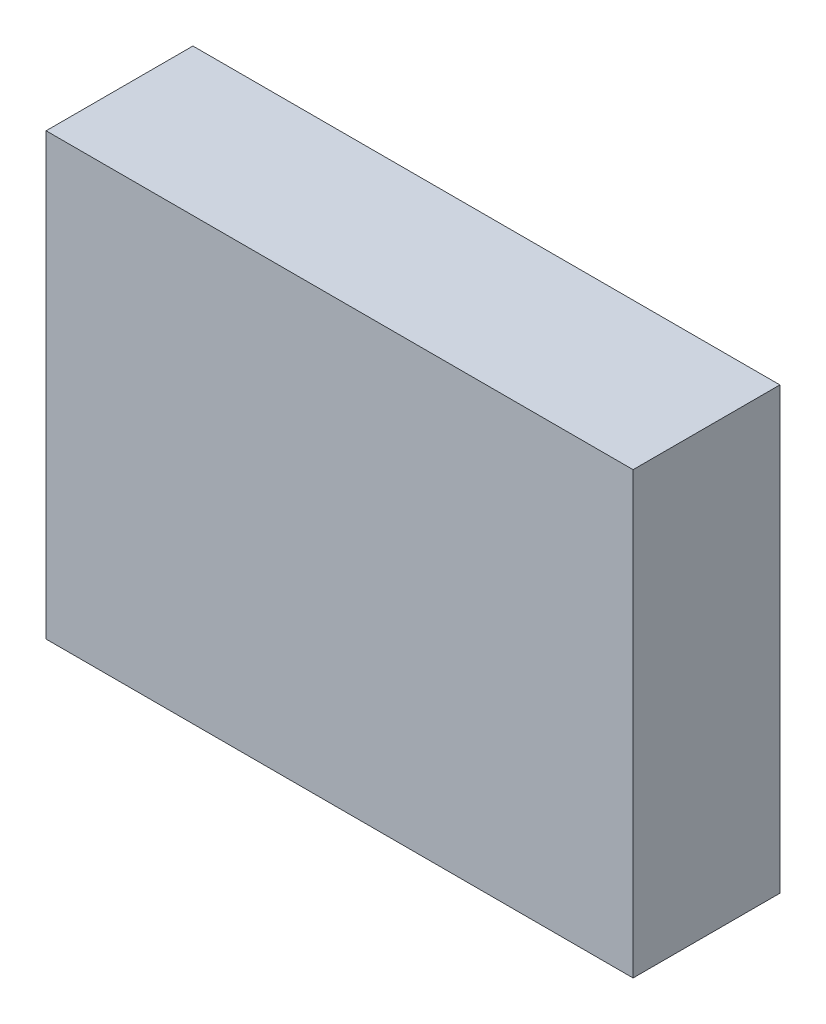
ISO-10303-21;
HEADER;
FILE_DESCRIPTION(('STEP AP214'),'2;1');
FILE_NAME('part.step','',(''),(''),'','','');
FILE_SCHEMA(('AUTOMOTIVE_DESIGN { 1 0 10303 214 1 1 1 1 }'));
ENDSEC;
DATA;
#1=APPLICATION_CONTEXT('core data for automotive mechanical design processes');
#2=APPLICATION_PROTOCOL_DEFINITION('international standard','automotive_design',2000,#1);
#3=PRODUCT_CONTEXT('',#1,'mechanical');
#4=PRODUCT('Part','Part','',(#3));
#5=PRODUCT_RELATED_PRODUCT_CATEGORY('part','',(#4));
#6=PRODUCT_DEFINITION_FORMATION('','',#4);
#7=PRODUCT_DEFINITION_CONTEXT('part definition',#1,'design');
#8=PRODUCT_DEFINITION('design','',#6,#7);
#9=PRODUCT_DEFINITION_SHAPE('','',#8);
#10=(LENGTH_UNIT() NAMED_UNIT(*) SI_UNIT(.MILLI.,.METRE.));
#11=(NAMED_UNIT(*) PLANE_ANGLE_UNIT() SI_UNIT($,.RADIAN.));
#12=(NAMED_UNIT(*) SI_UNIT($,.STERADIAN.) SOLID_ANGLE_UNIT());
#13=UNCERTAINTY_MEASURE_WITH_UNIT(LENGTH_MEASURE(1.E-05),#10,'distance_accuracy_value','');
#14=(GEOMETRIC_REPRESENTATION_CONTEXT(3) GLOBAL_UNCERTAINTY_ASSIGNED_CONTEXT((#13)) GLOBAL_UNIT_ASSIGNED_CONTEXT((#10,
#11,#12)) REPRESENTATION_CONTEXT('',''));
#15=CARTESIAN_POINT('',(0.,0.,0.));
#16=DIRECTION('',(0.,0.,1.));
#17=DIRECTION('',(1.,0.,0.));
#18=AXIS2_PLACEMENT_3D('',#15,#16,#17);
#19=CARTESIAN_POINT('',(58.7800865151283,48.6496566212927,43.6046360424313));
#20=DIRECTION('',(0.,0.,1.));
#21=DIRECTION('',(1.,0.,0.));
#22=AXIS2_PLACEMENT_3D('',#19,#20,#21);
#23=CYLINDRICAL_SURFACE('',#22,10.2);
#24=CARTESIAN_POINT('',(58.7800865151283,48.6496566212927,53.8046360424313));
#25=DIRECTION('',(0.,0.,1.));
#26=DIRECTION('',(1.,0.,0.));
#27=AXIS2_PLACEMENT_3D('',#24,#25,#26);
#28=CIRCLE('',#27,10.2);
#29=CARTESIAN_POINT('',(68.9800865151283,48.6496566212927,53.8046360424313));
#30=VERTEX_POINT('',#29);
#31=EDGE_CURVE('E367',#30,#30,#28,.T.);
#32=ORIENTED_EDGE('',*,*,#31,.F.);
#33=EDGE_LOOP('',(#32));
#34=FACE_BOUND('',#33,.T.);
#35=CARTESIAN_POINT('',(58.7800865151283,48.6496566212927,49.9796360424313));
#36=DIRECTION('',(0.,0.,-1.));
#37=DIRECTION('',(-1.,0.,0.));
#38=AXIS2_PLACEMENT_3D('',#35,#36,#37);
#39=CIRCLE('',#38,10.2);
#40=CARTESIAN_POINT('',(48.5800865151283,48.6496566212927,49.9796360424313));
#41=VERTEX_POINT('',#40);
#42=EDGE_CURVE('E36',#41,#41,#39,.F.);
#43=ORIENTED_EDGE('',*,*,#42,.T.);
#44=EDGE_LOOP('',(#43));
#45=FACE_BOUND('',#44,.T.);
#46=ADVANCED_FACE('F32',(#34,#45),#23,.T.);
#47=CARTESIAN_POINT('',(58.7800865151283,48.6496566212927,53.8046360424313));
#48=DIRECTION('',(0.,0.,1.));
#49=DIRECTION('',(1.,0.,0.));
#50=AXIS2_PLACEMENT_3D('',#47,#48,#49);
#51=PLANE('',#50);
#52=ORIENTED_EDGE('',*,*,#31,.T.);
#53=EDGE_LOOP('',(#52));
#54=FACE_BOUND('',#53,.T.);
#55=CARTESIAN_POINT('',(58.7800865151283,125.149656621293,53.8046360424313));
#56=DIRECTION('',(0.,0.,1.));
#57=DIRECTION('',(1.,0.,0.));
#58=AXIS2_PLACEMENT_3D('',#55,#56,#57);
#59=CIRCLE('',#58,4.08000000000001);
#60=CARTESIAN_POINT('',(62.3134701625688,127.189656621293,53.8046360424313));
#61=VERTEX_POINT('',#60);
#62=CARTESIAN_POINT('',(55.2467028676878,123.109656621293,53.8046360424313));
#63=VERTEX_POINT('',#62);
#64=EDGE_CURVE('E370',#61,#63,#59,.T.);
#65=ORIENTED_EDGE('',*,*,#64,.T.);
#66=DIRECTION('',(0.500000000000004,-0.866025403784436,0.));
#67=VECTOR('',#66,1.);
#68=CARTESIAN_POINT('',(55.2467028676878,123.109656621293,53.8046360424313));
#69=LINE('',#68,#67);
#70=CARTESIAN_POINT('',(75.646702867688,87.7758201468877,53.8046360424313));
#71=VERTEX_POINT('',#70);
#72=EDGE_CURVE('E224',#63,#71,#69,.T.);
#73=ORIENTED_EDGE('',*,*,#72,.T.);
#74=CARTESIAN_POINT('',(79.1800865151285,89.8158201468878,53.8046360424313));
#75=DIRECTION('',(0.,0.,1.));
#76=DIRECTION('',(1.,0.,0.));
#77=AXIS2_PLACEMENT_3D('',#74,#75,#76);
#78=CIRCLE('',#77,4.08000000000001);
#79=CARTESIAN_POINT('',(82.713470162569,91.8558201468878,53.8046360424313));
#80=VERTEX_POINT('',#79);
#81=EDGE_CURVE('E373',#71,#80,#78,.T.);
#82=ORIENTED_EDGE('',*,*,#81,.T.);
#83=DIRECTION('',(0.500000000000004,-0.866025403784436,0.));
#84=VECTOR('',#83,1.);
#85=CARTESIAN_POINT('',(62.3134701625688,127.189656621293,53.8046360424313));
#86=LINE('',#85,#84);
#87=EDGE_CURVE('E228',#61,#80,#86,.T.);
#88=ORIENTED_EDGE('',*,*,#87,.F.);
#89=EDGE_LOOP('',(#65,#73,#82,#88));
#90=FACE_BOUND('',#89,.T.);
#91=DIRECTION('',(-0.46947156278591,0.882947592858916,0.));
#92=VECTOR('',#91,1.);
#93=CARTESIAN_POINT('',(82.1682764227084,64.0581072660459,53.8046360424313));
#94=LINE('',#93,#92);
#95=CARTESIAN_POINT('',(51.6898414890395,121.37970646813,53.8046360424313));
#96=VERTEX_POINT('',#95);
#97=CARTESIAN_POINT('',(82.5737136124385,63.2955908132851,53.8046360424313));
#98=VERTEX_POINT('',#97);
#99=EDGE_CURVE('E277',#96,#98,#94,.F.);
#100=ORIENTED_EDGE('',*,*,#99,.F.);
#101=CARTESIAN_POINT('',(58.7800865151283,125.149656621293,53.8046360424313));
#102=DIRECTION('',(0.,0.,1.));
#103=DIRECTION('',(1.,0.,0.));
#104=AXIS2_PLACEMENT_3D('',#101,#102,#103);
#105=CIRCLE('',#104,8.03019916859524);
#106=CARTESIAN_POINT('',(65.437423340994,129.640087009828,53.8046360424313));
#107=VERTEX_POINT('',#106);
#108=EDGE_CURVE('E275',#107,#96,#105,.T.);
#109=ORIENTED_EDGE('',*,*,#108,.F.);
#110=DIRECTION('',(0.559192903470749,-0.82903757255504,0.));
#111=VECTOR('',#110,1.);
#112=CARTESIAN_POINT('',(65.437423340994,129.640087009828,53.8046360424313));
#113=LINE('',#112,#111);
#114=CARTESIAN_POINT('',(109.068239218926,64.9547423648411,53.8046360424313));
#115=VERTEX_POINT('',#114);
#116=EDGE_CURVE('E260',#115,#107,#113,.F.);
#117=ORIENTED_EDGE('',*,*,#116,.F.);
#118=DIRECTION('',(0.998044963916957,0.0625,0.));
#119=VECTOR('',#118,1.);
#120=CARTESIAN_POINT('',(57.9594490670911,61.7541857767358,53.8046360424313));
#121=LINE('',#120,#119);
#122=CARTESIAN_POINT('',(139.240699067091,66.8442150927123,53.8046360424313));
#123=VERTEX_POINT('',#122);
#124=EDGE_CURVE('E249',#123,#115,#121,.F.);
#125=ORIENTED_EDGE('',*,*,#124,.F.);
#126=CARTESIAN_POINT('',(140.380086515128,48.6496566212927,53.8046360424313));
#127=DIRECTION('',(0.,0.,1.));
#128=DIRECTION('',(1.,0.,0.));
#129=AXIS2_PLACEMENT_3D('',#126,#127,#128);
#130=CIRCLE('',#129,18.2301991685952);
#131=CARTESIAN_POINT('',(139.240699067091,30.4550981498732,53.8046360424313));
#132=VERTEX_POINT('',#131);
#133=EDGE_CURVE('E247',#132,#123,#130,.T.);
#134=ORIENTED_EDGE('',*,*,#133,.F.);
#135=DIRECTION('',(-0.998044963916957,0.0625,0.));
#136=VECTOR('',#135,1.);
#137=CARTESIAN_POINT('',(139.240699067091,30.4550981498732,53.8046360424313));
#138=LINE('',#137,#136);
#139=CARTESIAN_POINT('',(57.9594490670911,35.5451274658496,53.8046360424313));
#140=VERTEX_POINT('',#139);
#141=EDGE_CURVE('E245',#140,#132,#138,.F.);
#142=ORIENTED_EDGE('',*,*,#141,.F.);
#143=CARTESIAN_POINT('',(58.7800865151283,48.6496566212927,53.8046360424313));
#144=DIRECTION('',(0.,0.,1.));
#145=DIRECTION('',(1.,0.,0.));
#146=AXIS2_PLACEMENT_3D('',#143,#144,#145);
#147=CIRCLE('',#146,13.1301991685952);
#148=CARTESIAN_POINT('',(57.9594490670911,61.7541857767358,53.8046360424313));
#149=VERTEX_POINT('',#148);
#150=EDGE_CURVE('E243',#149,#140,#147,.T.);
#151=ORIENTED_EDGE('',*,*,#150,.F.);
#152=DIRECTION('',(0.998044963916957,0.0625,0.));
#153=VECTOR('',#152,1.);
#154=CARTESIAN_POINT('',(57.9594490670911,61.7541857767358,53.8046360424313));
#155=LINE('',#154,#153);
#156=EDGE_CURVE('E237',#98,#149,#155,.F.);
#157=ORIENTED_EDGE('',*,*,#156,.F.);
#158=EDGE_LOOP('',(#100,#109,#117,#125,#134,#142,#151,#157));
#159=FACE_BOUND('',#158,.T.);
#160=DIRECTION('',(-0.866025403784439,-0.5,0.));
#161=VECTOR('',#160,1.);
#162=CARTESIAN_POINT('',(140.380086515128,62.7831912110548,53.8046360424313));
#163=LINE('',#162,#161);
#164=CARTESIAN_POINT('',(140.380086515128,62.7831912110548,53.8046360424313));
#165=VERTEX_POINT('',#164);
#166=CARTESIAN_POINT('',(128.140086515128,55.7164239161738,53.8046360424313));
#167=VERTEX_POINT('',#166);
#168=EDGE_CURVE('E342',#165,#167,#163,.T.);
#169=ORIENTED_EDGE('',*,*,#168,.T.);
#170=DIRECTION('',(0.,-1.,0.));
#171=VECTOR('',#170,1.);
#172=CARTESIAN_POINT('',(128.140086515128,55.7164239161738,53.8046360424313));
#173=LINE('',#172,#171);
#174=CARTESIAN_POINT('',(128.140086515128,41.5828893264117,53.8046360424313));
#175=VERTEX_POINT('',#174);
#176=EDGE_CURVE('E344',#167,#175,#173,.T.);
#177=ORIENTED_EDGE('',*,*,#176,.T.);
#178=DIRECTION('',(0.866025403784438,-0.5,0.));
#179=VECTOR('',#178,1.);
#180=CARTESIAN_POINT('',(128.140086515128,41.5828893264117,53.8046360424313));
#181=LINE('',#180,#179);
#182=CARTESIAN_POINT('',(140.380086515128,34.5161220315307,53.8046360424313));
#183=VERTEX_POINT('',#182);
#184=EDGE_CURVE('E346',#175,#183,#181,.T.);
#185=ORIENTED_EDGE('',*,*,#184,.T.);
#186=DIRECTION('',(0.866025403784439,0.499999999999999,0.));
#187=VECTOR('',#186,1.);
#188=CARTESIAN_POINT('',(140.380086515128,34.5161220315307,53.8046360424313));
#189=LINE('',#188,#187);
#190=CARTESIAN_POINT('',(152.620086515128,41.5828893264117,53.8046360424313));
#191=VERTEX_POINT('',#190);
#192=EDGE_CURVE('E348',#183,#191,#189,.T.);
#193=ORIENTED_EDGE('',*,*,#192,.T.);
#194=DIRECTION('',(0.,1.,0.));
#195=VECTOR('',#194,1.);
#196=CARTESIAN_POINT('',(152.620086515128,41.5828893264117,53.8046360424313));
#197=LINE('',#196,#195);
#198=CARTESIAN_POINT('',(152.620086515128,55.7164239161737,53.8046360424313));
#199=VERTEX_POINT('',#198);
#200=EDGE_CURVE('E329',#191,#199,#197,.T.);
#201=ORIENTED_EDGE('',*,*,#200,.T.);
#202=DIRECTION('',(-0.866025403784439,0.5,0.));
#203=VECTOR('',#202,1.);
#204=CARTESIAN_POINT('',(152.620086515128,55.7164239161737,53.8046360424313));
#205=LINE('',#204,#203);
#206=EDGE_CURVE('E273',#199,#165,#205,.T.);
#207=ORIENTED_EDGE('',*,*,#206,.T.);
#208=EDGE_LOOP('',(#169,#177,#185,#193,#201,#207));
#209=FACE_BOUND('',#208,.T.);
#210=ADVANCED_FACE('F424',(#54,#90,#159,#209),#51,.F.);
#211=CARTESIAN_POINT('',(57.8238365151283,63.9197445692222,49.9796360424313));
#212=DIRECTION('',(-0.062347753141239,0.99561377654642,0.0697564737441255));
#213=DIRECTION('',(0.,-0.0698924504621114,0.997554532528624));
#214=AXIS2_PLACEMENT_3D('',#211,#212,#213);
#215=PLANE('',#214);
#216=DIRECTION('',(-0.00435977960900764,0.0696200973209299,-0.997564050259824));
#217=VECTOR('',#216,1.);
#218=CARTESIAN_POINT('',(57.8238365151283,63.9197445692222,49.9796360424313));
#219=LINE('',#218,#217);
#220=CARTESIAN_POINT('',(57.832259650683,63.7852378808905,51.9069392488693));
#221=VERTEX_POINT('',#220);
#222=CARTESIAN_POINT('',(57.8238365151283,63.9197445692222,49.9796360424313));
#223=VERTEX_POINT('',#222);
#224=EDGE_CURVE('E401',#221,#223,#219,.T.);
#225=ORIENTED_EDGE('',*,*,#224,.T.);
#226=DIRECTION('',(0.998044963916957,0.0625,0.));
#227=VECTOR('',#226,1.);
#228=CARTESIAN_POINT('',(57.8238365151283,63.9197445692222,49.9796360424313));
#229=LINE('',#228,#227);
#230=CARTESIAN_POINT('',(79.0767372561525,65.2506528392273,49.9796360424313));
#231=VERTEX_POINT('',#230);
#232=EDGE_CURVE('E217',#223,#231,#229,.T.);
#233=ORIENTED_EDGE('',*,*,#232,.T.);
#234=DIRECTION('',(0.111770297758268,-0.0624876586261861,0.991767459164922));
#235=VECTOR('',#234,1.);
#236=CARTESIAN_POINT('',(78.8205286948092,65.393891905772,47.7062296098094));
#237=LINE('',#236,#235);
#238=CARTESIAN_POINT('',(79.2939406451762,65.1292204775177,51.9069392488693));
#239=VERTEX_POINT('',#238);
#240=EDGE_CURVE('E398',#239,#231,#237,.F.);
#241=ORIENTED_EDGE('',*,*,#240,.F.);
#242=DIRECTION('',(0.998044963916957,0.0625,0.));
#243=VECTOR('',#242,1.);
#244=CARTESIAN_POINT('',(57.832259650683,63.7852378808905,51.9069392488693));
#245=LINE('',#244,#243);
#246=EDGE_CURVE('E257',#221,#239,#245,.T.);
#247=ORIENTED_EDGE('',*,*,#246,.F.);
#248=EDGE_LOOP('',(#225,#233,#241,#247));
#249=FACE_BOUND('',#248,.T.);
#250=ADVANCED_FACE('F444',(#249),#215,.F.);
#251=DIRECTION('',(0.0354702959443273,0.0720586830829992,-0.996769484032274));
#252=VECTOR('',#251,1.);
#253=CARTESIAN_POINT('',(110.098194501815,67.0471190801594,52.0659172440191));
#254=LINE('',#253,#252);
#255=CARTESIAN_POINT('',(110.172435349703,67.1979409886704,49.9796360424313));
#256=VERTEX_POINT('',#255);
#257=CARTESIAN_POINT('',(110.10385177426,67.0586119530385,51.9069392488693));
#258=VERTEX_POINT('',#257);
#259=EDGE_CURVE('E386',#256,#258,#254,.F.);
#260=ORIENTED_EDGE('',*,*,#259,.F.);
#261=CARTESIAN_POINT('',(139.105086515128,69.0097738851986,49.9796360424313));
#262=VERTEX_POINT('',#261);
#263=EDGE_CURVE('E418',#256,#262,#229,.T.);
#264=ORIENTED_EDGE('',*,*,#263,.T.);
#265=DIRECTION('',(-0.00435977960900784,0.0696200973209298,-0.997564050259824));
#266=VECTOR('',#265,1.);
#267=CARTESIAN_POINT('',(139.105086515128,69.0097738851986,49.9796360424313));
#268=LINE('',#267,#266);
#269=CARTESIAN_POINT('',(139.113509650683,68.875267196867,51.9069392488693));
#270=VERTEX_POINT('',#269);
#271=EDGE_CURVE('E407',#270,#262,#268,.T.);
#272=ORIENTED_EDGE('',*,*,#271,.F.);
#273=DIRECTION('',(0.998044963916957,0.0625,0.));
#274=VECTOR('',#273,1.);
#275=CARTESIAN_POINT('',(57.832259650683,63.7852378808905,51.9069392488693));
#276=LINE('',#275,#274);
#277=EDGE_CURVE('E233',#258,#270,#276,.T.);
#278=ORIENTED_EDGE('',*,*,#277,.F.);
#279=EDGE_LOOP('',(#260,#264,#272,#278));
#280=FACE_BOUND('',#279,.T.);
#281=ADVANCED_FACE('F503',(#280),#215,.F.);
#282=CARTESIAN_POINT('',(58.7800865151283,48.6496566212927,49.9796360424313));
#283=DIRECTION('',(0.,0.,-1.));
#284=DIRECTION('',(1.,0.,0.));
#285=AXIS2_PLACEMENT_3D('',#282,#283,#284);
#286=CONICAL_SURFACE('',#285,15.3,0.0698131700797733);
#287=DIRECTION('',(-0.00435977960900784,-0.0696200973209298,-0.997564050259824));
#288=VECTOR('',#287,1.);
#289=CARTESIAN_POINT('',(57.8238365151283,33.3795686733633,49.9796360424313));
#290=LINE('',#289,#288);
#291=CARTESIAN_POINT('',(57.832259650683,33.5140753616949,51.9069392488693));
#292=VERTEX_POINT('',#291);
#293=CARTESIAN_POINT('',(57.8238365151283,33.3795686733633,49.9796360424313));
#294=VERTEX_POINT('',#293);
#295=EDGE_CURVE('E402',#292,#294,#290,.T.);
#296=ORIENTED_EDGE('',*,*,#295,.T.);
#297=CARTESIAN_POINT('',(58.7800865151283,48.6496566212927,49.9796360424313));
#298=DIRECTION('',(0.,0.,1.));
#299=DIRECTION('',(1.,0.,0.));
#300=AXIS2_PLACEMENT_3D('',#297,#298,#299);
#301=CIRCLE('',#300,15.3);
#302=EDGE_CURVE('E404',#223,#294,#301,.T.);
#303=ORIENTED_EDGE('',*,*,#302,.F.);
#304=ORIENTED_EDGE('',*,*,#224,.F.);
#305=CARTESIAN_POINT('',(58.7800865151283,48.6496566212927,51.9069392488693));
#306=DIRECTION('',(0.,0.,-1.));
#307=DIRECTION('',(-1.,0.,0.));
#308=AXIS2_PLACEMENT_3D('',#305,#306,#307);
#309=CIRCLE('',#308,15.1652298311253);
#310=EDGE_CURVE('E255',#292,#221,#309,.T.);
#311=ORIENTED_EDGE('',*,*,#310,.F.);
#312=EDGE_LOOP('',(#296,#303,#304,#311));
#313=FACE_BOUND('',#312,.T.);
#314=ADVANCED_FACE('F526',(#313),#286,.F.);
#315=CARTESIAN_POINT('',(57.8238365151283,33.3795686733633,49.9796360424313));
#316=DIRECTION('',(-0.062347753141239,-0.99561377654642,0.0697564737441255));
#317=DIRECTION('',(0.,-0.0698924504621114,-0.997554532528624));
#318=AXIS2_PLACEMENT_3D('',#315,#316,#317);
#319=PLANE('',#318);
#320=DIRECTION('',(-0.0043597796090078,-0.0696200973209298,-0.997564050259824));
#321=VECTOR('',#320,1.);
#322=CARTESIAN_POINT('',(139.105086515128,28.2895393573868,49.9796360424313));
#323=LINE('',#322,#321);
#324=CARTESIAN_POINT('',(139.113509650683,28.4240460457185,51.9069392488693));
#325=VERTEX_POINT('',#324);
#326=CARTESIAN_POINT('',(139.105086515128,28.2895393573868,49.9796360424313));
#327=VERTEX_POINT('',#326);
#328=EDGE_CURVE('E405',#325,#327,#323,.T.);
#329=ORIENTED_EDGE('',*,*,#328,.T.);
#330=DIRECTION('',(0.998044963916957,-0.0625,0.));
#331=VECTOR('',#330,1.);
#332=CARTESIAN_POINT('',(57.8238365151283,33.3795686733633,49.9796360424313));
#333=LINE('',#332,#331);
#334=EDGE_CURVE('E412',#294,#327,#333,.T.);
#335=ORIENTED_EDGE('',*,*,#334,.F.);
#336=ORIENTED_EDGE('',*,*,#295,.F.);
#337=DIRECTION('',(0.998044963916957,-0.0625,0.));
#338=VECTOR('',#337,1.);
#339=CARTESIAN_POINT('',(57.832259650683,33.5140753616949,51.9069392488693));
#340=LINE('',#339,#338);
#341=EDGE_CURVE('E253',#325,#292,#340,.F.);
#342=ORIENTED_EDGE('',*,*,#341,.F.);
#343=EDGE_LOOP('',(#329,#335,#336,#342));
#344=FACE_BOUND('',#343,.T.);
#345=ADVANCED_FACE('F530',(#344),#319,.F.);
#346=CARTESIAN_POINT('',(140.380086515128,48.6496566212927,49.9796360424313));
#347=DIRECTION('',(0.,0.,-1.));
#348=DIRECTION('',(-1.,0.,0.));
#349=AXIS2_PLACEMENT_3D('',#346,#347,#348);
#350=CONICAL_SURFACE('',#349,20.4,0.0698131700797733);
#351=ORIENTED_EDGE('',*,*,#271,.T.);
#352=CARTESIAN_POINT('',(140.380086515128,48.6496566212927,49.9796360424313));
#353=DIRECTION('',(0.,0.,-1.));
#354=DIRECTION('',(-1.,0.,0.));
#355=AXIS2_PLACEMENT_3D('',#352,#353,#354);
#356=CIRCLE('',#355,20.4);
#357=EDGE_CURVE('E415',#262,#327,#356,.T.);
#358=ORIENTED_EDGE('',*,*,#357,.T.);
#359=ORIENTED_EDGE('',*,*,#328,.F.);
#360=CARTESIAN_POINT('',(140.380086515128,48.6496566212927,51.9069392488693));
#361=DIRECTION('',(0.,0.,1.));
#362=DIRECTION('',(1.,0.,0.));
#363=AXIS2_PLACEMENT_3D('',#360,#361,#362);
#364=CIRCLE('',#363,20.2652298311253);
#365=EDGE_CURVE('E251',#270,#325,#364,.F.);
#366=ORIENTED_EDGE('',*,*,#365,.F.);
#367=EDGE_LOOP('',(#351,#358,#359,#366));
#368=FACE_BOUND('',#367,.T.);
#369=ADVANCED_FACE('F535',(#368),#350,.F.);
#370=CARTESIAN_POINT('',(58.7800865151283,125.149656621293,49.9796360424313));
#371=DIRECTION('',(0.,0.,-1.));
#372=DIRECTION('',(1.,0.,0.));
#373=AXIS2_PLACEMENT_3D('',#370,#371,#372);
#374=CONICAL_SURFACE('',#373,10.2,0.0698131700797733);
#375=DIRECTION('',(-0.0615913105787018,-0.0327486807430889,-0.997564050259824));
#376=VECTOR('',#375,1.);
#377=CARTESIAN_POINT('',(49.7740210679674,120.361046680876,49.9796360424313));
#378=LINE('',#377,#376);
#379=CARTESIAN_POINT('',(49.8930160641645,120.424317442675,51.9069392488693));
#380=VERTEX_POINT('',#379);
#381=CARTESIAN_POINT('',(49.7740210679674,120.361046680876,49.9796360424313));
#382=VERTEX_POINT('',#381);
#383=EDGE_CURVE('E390',#380,#382,#378,.T.);
#384=ORIENTED_EDGE('',*,*,#383,.T.);
#385=CARTESIAN_POINT('',(58.7800865151283,125.149656621293,49.9796360424313));
#386=DIRECTION('',(0.,0.,1.));
#387=DIRECTION('',(1.,0.,0.));
#388=AXIS2_PLACEMENT_3D('',#385,#386,#387);
#389=CIRCLE('',#388,10.2);
#390=CARTESIAN_POINT('',(67.2362697551897,130.853424236694,49.9796360424313));
#391=VERTEX_POINT('',#390);
#392=EDGE_CURVE('E391',#391,#382,#389,.T.);
#393=ORIENTED_EDGE('',*,*,#392,.F.);
#394=DIRECTION('',(0.0578307376628291,0.0390073250888586,-0.997564050259824));
#395=VECTOR('',#394,1.);
#396=CARTESIAN_POINT('',(67.2362697551897,130.853424236694,49.9796360424313));
#397=LINE('',#396,#395);
#398=CARTESIAN_POINT('',(67.124540221533,130.77806171466,51.9069392488693));
#399=VERTEX_POINT('',#398);
#400=EDGE_CURVE('E379',#399,#391,#397,.T.);
#401=ORIENTED_EDGE('',*,*,#400,.F.);
#402=CARTESIAN_POINT('',(58.7800865151283,125.149656621293,51.9069392488693));
#403=DIRECTION('',(0.,0.,-1.));
#404=DIRECTION('',(-1.,0.,0.));
#405=AXIS2_PLACEMENT_3D('',#402,#403,#404);
#406=CIRCLE('',#405,10.0652298311253);
#407=EDGE_CURVE('E282',#380,#399,#406,.T.);
#408=ORIENTED_EDGE('',*,*,#407,.F.);
#409=EDGE_LOOP('',(#384,#393,#401,#408));
#410=FACE_BOUND('',#409,.T.);
#411=ADVANCED_FACE('F512',(#410),#374,.F.);
#412=CARTESIAN_POINT('',(49.7740210679674,120.361046680876,49.9796360424313));
#413=DIRECTION('',(-0.880796776899503,-0.468327953654522,0.0697564737441255));
#414=DIRECTION('',(0.46947156278591,-0.882947592858916,0.));
#415=AXIS2_PLACEMENT_3D('',#412,#413,#414);
#416=PLANE('',#415);
#417=ORIENTED_EDGE('',*,*,#240,.T.);
#418=DIRECTION('',(0.469471562785911,-0.882947592858917,0.));
#419=VECTOR('',#418,1.);
#420=CARTESIAN_POINT('',(49.7740210679674,120.361046680876,49.9796360424313));
#421=LINE('',#420,#419);
#422=EDGE_CURVE('E387',#382,#231,#421,.T.);
#423=ORIENTED_EDGE('',*,*,#422,.F.);
#424=ORIENTED_EDGE('',*,*,#383,.F.);
#425=DIRECTION('',(0.46947156278591,-0.882947592858916,0.));
#426=VECTOR('',#425,1.);
#427=CARTESIAN_POINT('',(49.8930160641645,120.424317442675,51.9069392488693));
#428=LINE('',#427,#426);
#429=EDGE_CURVE('E280',#239,#380,#428,.F.);
#430=ORIENTED_EDGE('',*,*,#429,.F.);
#431=EDGE_LOOP('',(#417,#423,#424,#430));
#432=FACE_BOUND('',#431,.T.);
#433=ADVANCED_FACE('F517',(#432),#416,.F.);
#434=CARTESIAN_POINT('',(67.2362697551897,130.853424236694,49.9796360424313));
#435=DIRECTION('',(0.827018078695579,0.557830737662832,0.0697564737441255));
#436=DIRECTION('',(-0.559192903470749,0.82903757255504,0.));
#437=AXIS2_PLACEMENT_3D('',#434,#435,#436);
#438=PLANE('',#437);
#439=ORIENTED_EDGE('',*,*,#400,.T.);
#440=DIRECTION('',(-0.559192903470749,0.82903757255504,0.));
#441=VECTOR('',#440,1.);
#442=CARTESIAN_POINT('',(67.2362697551897,130.853424236694,49.9796360424313));
#443=LINE('',#442,#441);
#444=EDGE_CURVE('E383',#256,#391,#443,.T.);
#445=ORIENTED_EDGE('',*,*,#444,.F.);
#446=ORIENTED_EDGE('',*,*,#259,.T.);
#447=DIRECTION('',(-0.559192903470749,0.82903757255504,0.));
#448=VECTOR('',#447,1.);
#449=CARTESIAN_POINT('',(111.379882487331,65.1668186232166,51.9069392488693));
#450=LINE('',#449,#448);
#451=EDGE_CURVE('E284',#399,#258,#450,.F.);
#452=ORIENTED_EDGE('',*,*,#451,.F.);
#453=EDGE_LOOP('',(#439,#445,#446,#452));
#454=FACE_BOUND('',#453,.T.);
#455=ADVANCED_FACE('F436',(#454),#438,.F.);
#456=CARTESIAN_POINT('',(58.7800865151283,125.149656621293,43.6046360424313));
#457=DIRECTION('',(0.,0.,1.));
#458=DIRECTION('',(1.,0.,0.));
#459=AXIS2_PLACEMENT_3D('',#456,#457,#458);
#460=CYLINDRICAL_SURFACE('',#459,4.08000000000001);
#461=DIRECTION('',(0.,0.,1.));
#462=VECTOR('',#461,1.);
#463=CARTESIAN_POINT('',(62.3134701625688,127.189656621293,43.6046360424313));
#464=LINE('',#463,#462);
#465=CARTESIAN_POINT('',(62.3134701625688,127.189656621293,49.9796360424313));
#466=VERTEX_POINT('',#465);
#467=EDGE_CURVE('E231',#466,#61,#464,.T.);
#468=ORIENTED_EDGE('',*,*,#467,.F.);
#469=CARTESIAN_POINT('',(58.7800865151283,125.149656621293,49.9796360424313));
#470=DIRECTION('',(0.,0.,1.));
#471=DIRECTION('',(1.,0.,0.));
#472=AXIS2_PLACEMENT_3D('',#469,#470,#471);
#473=CIRCLE('',#472,4.08000000000001);
#474=CARTESIAN_POINT('',(55.2467028676878,123.109656621293,49.9796360424313));
#475=VERTEX_POINT('',#474);
#476=EDGE_CURVE('E211',#466,#475,#473,.T.);
#477=ORIENTED_EDGE('',*,*,#476,.T.);
#478=DIRECTION('',(0.,0.,1.));
#479=VECTOR('',#478,1.);
#480=CARTESIAN_POINT('',(55.2467028676878,123.109656621293,43.6046360424313));
#481=LINE('',#480,#479);
#482=EDGE_CURVE('E221',#475,#63,#481,.T.);
#483=ORIENTED_EDGE('',*,*,#482,.T.);
#484=ORIENTED_EDGE('',*,*,#64,.F.);
#485=EDGE_LOOP('',(#468,#477,#483,#484));
#486=FACE_BOUND('',#485,.T.);
#487=ADVANCED_FACE('F230',(#486),#460,.T.);
#488=CARTESIAN_POINT('',(62.3134701625688,127.189656621293,43.6046360424313));
#489=DIRECTION('',(-0.866025403784436,-0.500000000000004,0.));
#490=DIRECTION('',(0.500000000000004,-0.866025403784436,0.));
#491=AXIS2_PLACEMENT_3D('',#488,#489,#490);
#492=PLANE('',#491);
#493=DIRECTION('',(0.500000000000004,-0.866025403784436,0.));
#494=VECTOR('',#493,1.);
#495=CARTESIAN_POINT('',(62.3134701625688,127.189656621293,49.9796360424313));
#496=LINE('',#495,#494);
#497=CARTESIAN_POINT('',(82.713470162569,91.8558201468878,49.9796360424313));
#498=VERTEX_POINT('',#497);
#499=EDGE_CURVE('E234',#466,#498,#496,.T.);
#500=ORIENTED_EDGE('',*,*,#499,.F.);
#501=ORIENTED_EDGE('',*,*,#467,.T.);
#502=ORIENTED_EDGE('',*,*,#87,.T.);
#503=DIRECTION('',(0.,0.,1.));
#504=VECTOR('',#503,1.);
#505=CARTESIAN_POINT('',(82.713470162569,91.8558201468878,43.6046360424313));
#506=LINE('',#505,#504);
#507=EDGE_CURVE('E380',#498,#80,#506,.T.);
#508=ORIENTED_EDGE('',*,*,#507,.F.);
#509=EDGE_LOOP('',(#500,#501,#502,#508));
#510=FACE_BOUND('',#509,.T.);
#511=ADVANCED_FACE('F428',(#510),#492,.F.);
#512=CARTESIAN_POINT('',(79.1800865151285,89.8158201468878,43.6046360424313));
#513=DIRECTION('',(0.,0.,1.));
#514=DIRECTION('',(1.,0.,0.));
#515=AXIS2_PLACEMENT_3D('',#512,#513,#514);
#516=CYLINDRICAL_SURFACE('',#515,4.08000000000001);
#517=DIRECTION('',(0.,0.,1.));
#518=VECTOR('',#517,1.);
#519=CARTESIAN_POINT('',(75.646702867688,87.7758201468877,43.6046360424313));
#520=LINE('',#519,#518);
#521=CARTESIAN_POINT('',(75.646702867688,87.7758201468877,49.9796360424313));
#522=VERTEX_POINT('',#521);
#523=EDGE_CURVE('E227',#522,#71,#520,.T.);
#524=ORIENTED_EDGE('',*,*,#523,.F.);
#525=CARTESIAN_POINT('',(79.1800865151285,89.8158201468878,49.9796360424313));
#526=DIRECTION('',(0.,0.,1.));
#527=DIRECTION('',(1.,0.,0.));
#528=AXIS2_PLACEMENT_3D('',#525,#526,#527);
#529=CIRCLE('',#528,4.08000000000001);
#530=EDGE_CURVE('E214',#522,#498,#529,.T.);
#531=ORIENTED_EDGE('',*,*,#530,.T.);
#532=ORIENTED_EDGE('',*,*,#507,.T.);
#533=ORIENTED_EDGE('',*,*,#81,.F.);
#534=EDGE_LOOP('',(#524,#531,#532,#533));
#535=FACE_BOUND('',#534,.T.);
#536=ADVANCED_FACE('F420',(#535),#516,.T.);
#537=CARTESIAN_POINT('',(55.2467028676878,123.109656621293,43.6046360424313));
#538=DIRECTION('',(-0.866025403784436,-0.500000000000004,0.));
#539=DIRECTION('',(0.500000000000004,-0.866025403784436,0.));
#540=AXIS2_PLACEMENT_3D('',#537,#538,#539);
#541=PLANE('',#540);
#542=ORIENTED_EDGE('',*,*,#482,.F.);
#543=DIRECTION('',(0.500000000000004,-0.866025403784436,0.));
#544=VECTOR('',#543,1.);
#545=CARTESIAN_POINT('',(55.2467028676878,123.109656621293,49.9796360424313));
#546=LINE('',#545,#544);
#547=EDGE_CURVE('E207',#475,#522,#546,.T.);
#548=ORIENTED_EDGE('',*,*,#547,.T.);
#549=ORIENTED_EDGE('',*,*,#523,.T.);
#550=ORIENTED_EDGE('',*,*,#72,.F.);
#551=EDGE_LOOP('',(#542,#548,#549,#550));
#552=FACE_BOUND('',#551,.T.);
#553=ADVANCED_FACE('F222',(#552),#541,.T.);
#554=CARTESIAN_POINT('',(152.620086515128,55.7164239161737,60.9446360424313));
#555=DIRECTION('',(-0.5,-0.866025403784439,0.));
#556=DIRECTION('',(0.866025403784439,-0.5,0.));
#557=AXIS2_PLACEMENT_3D('',#554,#555,#556);
#558=PLANE('',#557);
#559=ORIENTED_EDGE('',*,*,#206,.F.);
#560=DIRECTION('',(0.,0.,-1.));
#561=VECTOR('',#560,1.);
#562=CARTESIAN_POINT('',(152.620086515128,55.7164239161737,60.9446360424313));
#563=LINE('',#562,#561);
#564=CARTESIAN_POINT('',(152.620086515128,55.7164239161737,60.9446360424313));
#565=VERTEX_POINT('',#564);
#566=EDGE_CURVE('E339',#565,#199,#563,.T.);
#567=ORIENTED_EDGE('',*,*,#566,.F.);
#568=DIRECTION('',(-0.866025403784439,0.5,0.));
#569=VECTOR('',#568,1.);
#570=CARTESIAN_POINT('',(152.620086515128,55.7164239161737,60.9446360424313));
#571=LINE('',#570,#569);
#572=CARTESIAN_POINT('',(140.380086515128,62.7831912110548,60.9446360424313));
#573=VERTEX_POINT('',#572);
#574=EDGE_CURVE('E325',#565,#573,#571,.T.);
#575=ORIENTED_EDGE('',*,*,#574,.T.);
#576=DIRECTION('',(0.,0.,-1.));
#577=VECTOR('',#576,1.);
#578=CARTESIAN_POINT('',(140.380086515128,62.7831912110548,60.9446360424313));
#579=LINE('',#578,#577);
#580=EDGE_CURVE('E365',#573,#165,#579,.T.);
#581=ORIENTED_EDGE('',*,*,#580,.T.);
#582=EDGE_LOOP('',(#559,#567,#575,#581));
#583=FACE_BOUND('',#582,.T.);
#584=ADVANCED_FACE('F450',(#583),#558,.T.);
#585=CARTESIAN_POINT('',(140.380086515128,62.7831912110548,60.9446360424313));
#586=DIRECTION('',(0.5,-0.866025403784439,0.));
#587=DIRECTION('',(0.866025403784439,0.5,0.));
#588=AXIS2_PLACEMENT_3D('',#585,#586,#587);
#589=PLANE('',#588);
#590=ORIENTED_EDGE('',*,*,#168,.F.);
#591=ORIENTED_EDGE('',*,*,#580,.F.);
#592=DIRECTION('',(-0.866025403784439,-0.5,0.));
#593=VECTOR('',#592,1.);
#594=CARTESIAN_POINT('',(140.380086515128,62.7831912110548,60.9446360424313));
#595=LINE('',#594,#593);
#596=CARTESIAN_POINT('',(128.140086515128,55.7164239161738,60.9446360424313));
#597=VERTEX_POINT('',#596);
#598=EDGE_CURVE('E328',#573,#597,#595,.T.);
#599=ORIENTED_EDGE('',*,*,#598,.T.);
#600=DIRECTION('',(0.,0.,-1.));
#601=VECTOR('',#600,1.);
#602=CARTESIAN_POINT('',(128.140086515128,55.7164239161738,60.9446360424313));
#603=LINE('',#602,#601);
#604=EDGE_CURVE('E362',#597,#167,#603,.T.);
#605=ORIENTED_EDGE('',*,*,#604,.T.);
#606=EDGE_LOOP('',(#590,#591,#599,#605));
#607=FACE_BOUND('',#606,.T.);
#608=ADVANCED_FACE('F453',(#607),#589,.T.);
#609=CARTESIAN_POINT('',(128.140086515128,55.7164239161738,60.9446360424313));
#610=DIRECTION('',(1.,0.,0.));
#611=DIRECTION('',(0.,0.,-1.));
#612=AXIS2_PLACEMENT_3D('',#609,#610,#611);
#613=PLANE('',#612);
#614=ORIENTED_EDGE('',*,*,#176,.F.);
#615=ORIENTED_EDGE('',*,*,#604,.F.);
#616=DIRECTION('',(0.,-1.,0.));
#617=VECTOR('',#616,1.);
#618=CARTESIAN_POINT('',(128.140086515128,55.7164239161738,60.9446360424313));
#619=LINE('',#618,#617);
#620=CARTESIAN_POINT('',(128.140086515128,41.5828893264117,60.9446360424313));
#621=VERTEX_POINT('',#620);
#622=EDGE_CURVE('E331',#597,#621,#619,.T.);
#623=ORIENTED_EDGE('',*,*,#622,.T.);
#624=DIRECTION('',(0.,0.,-1.));
#625=VECTOR('',#624,1.);
#626=CARTESIAN_POINT('',(128.140086515128,41.5828893264117,60.9446360424313));
#627=LINE('',#626,#625);
#628=EDGE_CURVE('E359',#621,#175,#627,.T.);
#629=ORIENTED_EDGE('',*,*,#628,.T.);
#630=EDGE_LOOP('',(#614,#615,#623,#629));
#631=FACE_BOUND('',#630,.T.);
#632=ADVANCED_FACE('F457',(#631),#613,.T.);
#633=CARTESIAN_POINT('',(128.140086515128,41.5828893264117,60.9446360424313));
#634=DIRECTION('',(0.5,0.866025403784438,0.));
#635=DIRECTION('',(-0.866025403784438,0.500000000000001,0.));
#636=AXIS2_PLACEMENT_3D('',#633,#634,#635);
#637=PLANE('',#636);
#638=ORIENTED_EDGE('',*,*,#184,.F.);
#639=ORIENTED_EDGE('',*,*,#628,.F.);
#640=DIRECTION('',(0.866025403784438,-0.5,0.));
#641=VECTOR('',#640,1.);
#642=CARTESIAN_POINT('',(128.140086515128,41.5828893264117,60.9446360424313));
#643=LINE('',#642,#641);
#644=CARTESIAN_POINT('',(140.380086515128,34.5161220315307,60.9446360424313));
#645=VERTEX_POINT('',#644);
#646=EDGE_CURVE('E333',#621,#645,#643,.T.);
#647=ORIENTED_EDGE('',*,*,#646,.T.);
#648=DIRECTION('',(0.,0.,-1.));
#649=VECTOR('',#648,1.);
#650=CARTESIAN_POINT('',(140.380086515128,34.5161220315307,60.9446360424313));
#651=LINE('',#650,#649);
#652=EDGE_CURVE('E356',#645,#183,#651,.T.);
#653=ORIENTED_EDGE('',*,*,#652,.T.);
#654=EDGE_LOOP('',(#638,#639,#647,#653));
#655=FACE_BOUND('',#654,.T.);
#656=ADVANCED_FACE('F461',(#655),#637,.T.);
#657=CARTESIAN_POINT('',(140.380086515128,34.5161220315307,60.9446360424313));
#658=DIRECTION('',(-0.499999999999999,0.866025403784439,0.));
#659=DIRECTION('',(-0.866025403784439,-0.5,0.));
#660=AXIS2_PLACEMENT_3D('',#657,#658,#659);
#661=PLANE('',#660);
#662=ORIENTED_EDGE('',*,*,#192,.F.);
#663=ORIENTED_EDGE('',*,*,#652,.F.);
#664=DIRECTION('',(0.866025403784439,0.499999999999999,0.));
#665=VECTOR('',#664,1.);
#666=CARTESIAN_POINT('',(140.380086515128,34.5161220315307,60.9446360424313));
#667=LINE('',#666,#665);
#668=CARTESIAN_POINT('',(152.620086515128,41.5828893264117,60.9446360424313));
#669=VERTEX_POINT('',#668);
#670=EDGE_CURVE('E335',#645,#669,#667,.T.);
#671=ORIENTED_EDGE('',*,*,#670,.T.);
#672=DIRECTION('',(0.,0.,-1.));
#673=VECTOR('',#672,1.);
#674=CARTESIAN_POINT('',(152.620086515128,41.5828893264117,60.9446360424313));
#675=LINE('',#674,#673);
#676=EDGE_CURVE('E354',#669,#191,#675,.T.);
#677=ORIENTED_EDGE('',*,*,#676,.T.);
#678=EDGE_LOOP('',(#662,#663,#671,#677));
#679=FACE_BOUND('',#678,.T.);
#680=ADVANCED_FACE('F465',(#679),#661,.T.);
#681=CARTESIAN_POINT('',(152.620086515128,41.5828893264117,60.9446360424313));
#682=DIRECTION('',(-1.,0.,0.));
#683=DIRECTION('',(0.,0.,1.));
#684=AXIS2_PLACEMENT_3D('',#681,#682,#683);
#685=PLANE('',#684);
#686=ORIENTED_EDGE('',*,*,#200,.F.);
#687=ORIENTED_EDGE('',*,*,#676,.F.);
#688=DIRECTION('',(0.,1.,0.));
#689=VECTOR('',#688,1.);
#690=CARTESIAN_POINT('',(152.620086515128,41.5828893264117,60.9446360424313));
#691=LINE('',#690,#689);
#692=EDGE_CURVE('E337',#669,#565,#691,.T.);
#693=ORIENTED_EDGE('',*,*,#692,.T.);
#694=ORIENTED_EDGE('',*,*,#566,.T.);
#695=EDGE_LOOP('',(#686,#687,#693,#694));
#696=FACE_BOUND('',#695,.T.);
#697=ADVANCED_FACE('F469',(#696),#685,.T.);
#698=CARTESIAN_POINT('',(58.7800865151283,48.6496566212927,60.9446360424313));
#699=DIRECTION('',(0.,0.,1.));
#700=DIRECTION('',(1.,0.,0.));
#701=AXIS2_PLACEMENT_3D('',#698,#699,#700);
#702=PLANE('',#701);
#703=ORIENTED_EDGE('',*,*,#574,.F.);
#704=ORIENTED_EDGE('',*,*,#692,.F.);
#705=ORIENTED_EDGE('',*,*,#670,.F.);
#706=ORIENTED_EDGE('',*,*,#646,.F.);
#707=ORIENTED_EDGE('',*,*,#622,.F.);
#708=ORIENTED_EDGE('',*,*,#598,.F.);
#709=EDGE_LOOP('',(#703,#704,#705,#706,#707,#708));
#710=FACE_BOUND('',#709,.T.);
#711=ADVANCED_FACE('F473',(#710),#702,.F.);
#712=CARTESIAN_POINT('',(57.9594490670911,61.7541857767358,51.7646360424313));
#713=DIRECTION('',(0.998044963916957,0.0625,0.));
#714=DIRECTION('',(-0.0625,0.998044963916957,0.));
#715=AXIS2_PLACEMENT_3D('',#712,#713,#714);
#716=CYLINDRICAL_SURFACE('',#715,2.04);
#717=ORIENTED_EDGE('',*,*,#156,.T.);
#718=CARTESIAN_POINT('',(57.9594490670911,61.7541857767358,51.7646360424313));
#719=DIRECTION('',(-0.998044963916957,-0.0624999999999972,0.));
#720=DIRECTION('',(0.0624999999999972,-0.998044963916957,0.));
#721=AXIS2_PLACEMENT_3D('',#718,#719,#720);
#722=CIRCLE('',#721,2.04);
#723=EDGE_CURVE('E270',#149,#221,#722,.T.);
#724=ORIENTED_EDGE('',*,*,#723,.T.);
#725=ORIENTED_EDGE('',*,*,#246,.T.);
#726=CARTESIAN_POINT('',(82.5737136124385,63.2955908132851,51.7646360424313));
#727=DIRECTION('',(-0.487986703971336,-0.872851062179105,0.));
#728=DIRECTION('',(0.872851062179105,-0.487986703971336,0.));
#729=AXIS2_PLACEMENT_3D('',#726,#727,#728);
#730=ELLIPSE('',#729,3.76671574457345,2.04);
#731=EDGE_CURVE('E286',#98,#239,#730,.T.);
#732=ORIENTED_EDGE('',*,*,#731,.F.);
#733=EDGE_LOOP('',(#717,#724,#725,#732));
#734=FACE_BOUND('',#733,.T.);
#735=ADVANCED_FACE('F477',(#734),#716,.F.);
#736=CARTESIAN_POINT('',(58.7800865151283,48.6496566212927,51.7646360424313));
#737=DIRECTION('',(0.,0.,1.));
#738=DIRECTION('',(1.,0.,0.));
#739=AXIS2_PLACEMENT_3D('',#736,#737,#738);
#740=TOROIDAL_SURFACE('',#739,13.1301991685952,2.04);
#741=ORIENTED_EDGE('',*,*,#723,.F.);
#742=ORIENTED_EDGE('',*,*,#150,.T.);
#743=CARTESIAN_POINT('',(57.9594490670911,35.5451274658496,51.7646360424313));
#744=DIRECTION('',(0.998044963916957,-0.0624999999999999,0.));
#745=DIRECTION('',(0.0624999999999999,0.998044963916957,0.));
#746=AXIS2_PLACEMENT_3D('',#743,#744,#745);
#747=CIRCLE('',#746,2.04);
#748=EDGE_CURVE('E267',#140,#292,#747,.T.);
#749=ORIENTED_EDGE('',*,*,#748,.T.);
#750=ORIENTED_EDGE('',*,*,#310,.T.);
#751=EDGE_LOOP('',(#741,#742,#749,#750));
#752=FACE_BOUND('',#751,.T.);
#753=ADVANCED_FACE('F557',(#752),#740,.F.);
#754=CARTESIAN_POINT('',(57.9594490670911,35.5451274658496,51.7646360424313));
#755=DIRECTION('',(0.998044963916957,-0.0625,0.));
#756=DIRECTION('',(0.0625,0.998044963916957,0.));
#757=AXIS2_PLACEMENT_3D('',#754,#755,#756);
#758=CYLINDRICAL_SURFACE('',#757,2.04);
#759=ORIENTED_EDGE('',*,*,#748,.F.);
#760=ORIENTED_EDGE('',*,*,#141,.T.);
#761=CARTESIAN_POINT('',(139.240699067091,30.4550981498732,51.7646360424313));
#762=DIRECTION('',(0.998044963916957,-0.0625000000000022,0.));
#763=DIRECTION('',(0.0625000000000022,0.998044963916957,0.));
#764=AXIS2_PLACEMENT_3D('',#761,#762,#763);
#765=CIRCLE('',#764,2.04);
#766=EDGE_CURVE('E263',#132,#325,#765,.T.);
#767=ORIENTED_EDGE('',*,*,#766,.T.);
#768=ORIENTED_EDGE('',*,*,#341,.T.);
#769=EDGE_LOOP('',(#759,#760,#767,#768));
#770=FACE_BOUND('',#769,.T.);
#771=ADVANCED_FACE('F561',(#770),#758,.F.);
#772=CARTESIAN_POINT('',(140.380086515128,48.6496566212927,51.7646360424313));
#773=DIRECTION('',(0.,0.,1.));
#774=DIRECTION('',(1.,0.,0.));
#775=AXIS2_PLACEMENT_3D('',#772,#773,#774);
#776=TOROIDAL_SURFACE('',#775,18.2301991685952,2.04);
#777=ORIENTED_EDGE('',*,*,#766,.F.);
#778=ORIENTED_EDGE('',*,*,#133,.T.);
#779=CARTESIAN_POINT('',(139.240699067091,66.8442150927123,51.7646360424313));
#780=DIRECTION('',(-0.998044963916957,-0.0625000000000021,0.));
#781=DIRECTION('',(0.0625000000000021,-0.998044963916957,0.));
#782=AXIS2_PLACEMENT_3D('',#779,#780,#781);
#783=CIRCLE('',#782,2.04);
#784=EDGE_CURVE('E261',#123,#270,#783,.T.);
#785=ORIENTED_EDGE('',*,*,#784,.T.);
#786=ORIENTED_EDGE('',*,*,#365,.T.);
#787=EDGE_LOOP('',(#777,#778,#785,#786));
#788=FACE_BOUND('',#787,.T.);
#789=ADVANCED_FACE('F562',(#788),#776,.F.);
#790=CARTESIAN_POINT('',(57.9594490670911,61.7541857767358,51.7646360424313));
#791=DIRECTION('',(0.998044963916957,0.0625,0.));
#792=DIRECTION('',(-0.0625,0.998044963916957,0.));
#793=AXIS2_PLACEMENT_3D('',#790,#791,#792);
#794=CYLINDRICAL_SURFACE('',#793,2.04);
#795=ORIENTED_EDGE('',*,*,#277,.T.);
#796=ORIENTED_EDGE('',*,*,#784,.F.);
#797=ORIENTED_EDGE('',*,*,#124,.T.);
#798=CARTESIAN_POINT('',(109.068239218926,64.9547423648411,51.7646360424313));
#799=DIRECTION('',(-0.897194100920133,0.441636440156509,0.));
#800=DIRECTION('',(0.441636440156509,0.897194100920133,0.));
#801=AXIS2_PLACEMENT_3D('',#798,#799,#800);
#802=ELLIPSE('',#801,2.35066973929602,2.04);
#803=EDGE_CURVE('E288',#258,#115,#802,.F.);
#804=ORIENTED_EDGE('',*,*,#803,.F.);
#805=EDGE_LOOP('',(#795,#796,#797,#804));
#806=FACE_BOUND('',#805,.T.);
#807=ADVANCED_FACE('F540',(#806),#794,.F.);
#808=CARTESIAN_POINT('',(100.902205778174,77.0613848116695,51.7646360424313));
#809=DIRECTION('',(-0.559192903470749,0.82903757255504,0.));
#810=DIRECTION('',(-0.82903757255504,-0.559192903470749,0.));
#811=AXIS2_PLACEMENT_3D('',#808,#809,#810);
#812=CYLINDRICAL_SURFACE('',#811,2.04);
#813=ORIENTED_EDGE('',*,*,#803,.T.);
#814=ORIENTED_EDGE('',*,*,#116,.T.);
#815=CARTESIAN_POINT('',(65.437423340994,129.640087009828,51.7646360424313));
#816=DIRECTION('',(-0.559192903470747,0.829037572555042,0.));
#817=DIRECTION('',(-0.829037572555042,-0.559192903470747,0.));
#818=AXIS2_PLACEMENT_3D('',#815,#816,#817);
#819=CIRCLE('',#818,2.04);
#820=EDGE_CURVE('E264',#107,#399,#819,.T.);
#821=ORIENTED_EDGE('',*,*,#820,.T.);
#822=ORIENTED_EDGE('',*,*,#451,.T.);
#823=EDGE_LOOP('',(#813,#814,#821,#822));
#824=FACE_BOUND('',#823,.T.);
#825=ADVANCED_FACE('F544',(#824),#812,.F.);
#826=CARTESIAN_POINT('',(58.7800865151283,125.149656621293,51.7646360424313));
#827=DIRECTION('',(0.,0.,1.));
#828=DIRECTION('',(1.,0.,0.));
#829=AXIS2_PLACEMENT_3D('',#826,#827,#828);
#830=TOROIDAL_SURFACE('',#829,8.03019916859524,2.04);
#831=ORIENTED_EDGE('',*,*,#820,.F.);
#832=ORIENTED_EDGE('',*,*,#108,.T.);
#833=CARTESIAN_POINT('',(51.6898414890395,121.37970646813,51.7646360424313));
#834=DIRECTION('',(0.469471562785909,-0.882947592858917,0.));
#835=DIRECTION('',(0.882947592858917,0.469471562785909,0.));
#836=AXIS2_PLACEMENT_3D('',#833,#834,#835);
#837=CIRCLE('',#836,2.04);
#838=EDGE_CURVE('E292',#96,#380,#837,.T.);
#839=ORIENTED_EDGE('',*,*,#838,.T.);
#840=ORIENTED_EDGE('',*,*,#407,.T.);
#841=EDGE_LOOP('',(#831,#832,#839,#840));
#842=FACE_BOUND('',#841,.T.);
#843=ADVANCED_FACE('F487',(#842),#830,.F.);
#844=CARTESIAN_POINT('',(83.4005286392708,61.7405779103756,51.7646360424313));
#845=DIRECTION('',(0.46947156278591,-0.882947592858916,0.));
#846=DIRECTION('',(0.882947592858917,0.469471562785911,0.));
#847=AXIS2_PLACEMENT_3D('',#844,#845,#846);
#848=CYLINDRICAL_SURFACE('',#847,2.04);
#849=ORIENTED_EDGE('',*,*,#838,.F.);
#850=ORIENTED_EDGE('',*,*,#99,.T.);
#851=ORIENTED_EDGE('',*,*,#731,.T.);
#852=ORIENTED_EDGE('',*,*,#429,.T.);
#853=EDGE_LOOP('',(#849,#850,#851,#852));
#854=FACE_BOUND('',#853,.T.);
#855=ADVANCED_FACE('F481',(#854),#848,.F.);
#856=CARTESIAN_POINT('',(786.572800445907,210.744404142702,49.9796360424313));
#857=DIRECTION('',(0.,0.,-1.));
#858=DIRECTION('',(-1.,0.,0.));
#859=AXIS2_PLACEMENT_3D('',#856,#857,#858);
#860=PLANE('',#859);
#861=ORIENTED_EDGE('',*,*,#42,.F.);
#862=EDGE_LOOP('',(#861));
#863=FACE_BOUND('',#862,.T.);
#864=ADVANCED_FACE('F479',(#863),#860,.T.);
#865=ORIENTED_EDGE('',*,*,#476,.F.);
#866=ORIENTED_EDGE('',*,*,#499,.T.);
#867=ORIENTED_EDGE('',*,*,#530,.F.);
#868=ORIENTED_EDGE('',*,*,#547,.F.);
#869=EDGE_LOOP('',(#865,#866,#867,#868));
#870=FACE_BOUND('',#869,.T.);
#871=ADVANCED_FACE('F209',(#870),#860,.T.);
#872=ORIENTED_EDGE('',*,*,#263,.F.);
#873=ORIENTED_EDGE('',*,*,#444,.T.);
#874=ORIENTED_EDGE('',*,*,#392,.T.);
#875=ORIENTED_EDGE('',*,*,#422,.T.);
#876=ORIENTED_EDGE('',*,*,#232,.F.);
#877=ORIENTED_EDGE('',*,*,#302,.T.);
#878=ORIENTED_EDGE('',*,*,#334,.T.);
#879=ORIENTED_EDGE('',*,*,#357,.F.);
#880=EDGE_LOOP('',(#872,#873,#874,#875,#876,#877,#878,#879));
#881=FACE_BOUND('',#880,.T.);
#882=DIRECTION('',(0.,1.,0.));
#883=VECTOR('',#882,1.);
#884=CARTESIAN_POINT('',(0.,150.,49.9796360424313));
#885=LINE('',#884,#883);
#886=CARTESIAN_POINT('',(0.,0.,49.9796360424313));
#887=VERTEX_POINT('',#886);
#888=CARTESIAN_POINT('',(0.,150.,49.9796360424313));
#889=VERTEX_POINT('',#888);
#890=EDGE_CURVE('E54',#887,#889,#885,.T.);
#891=ORIENTED_EDGE('',*,*,#890,.T.);
#892=DIRECTION('',(1.,0.,0.));
#893=VECTOR('',#892,1.);
#894=CARTESIAN_POINT('',(200.,150.,49.9796360424313));
#895=LINE('',#894,#893);
#896=CARTESIAN_POINT('',(200.,150.,49.9796360424313));
#897=VERTEX_POINT('',#896);
#898=EDGE_CURVE('E48',#889,#897,#895,.T.);
#899=ORIENTED_EDGE('',*,*,#898,.T.);
#900=DIRECTION('',(0.,-1.,0.));
#901=VECTOR('',#900,1.);
#902=CARTESIAN_POINT('',(200.,0.,49.9796360424313));
#903=LINE('',#902,#901);
#904=CARTESIAN_POINT('',(200.,0.,49.9796360424313));
#905=VERTEX_POINT('',#904);
#906=EDGE_CURVE('E319',#897,#905,#903,.T.);
#907=ORIENTED_EDGE('',*,*,#906,.T.);
#908=DIRECTION('',(-1.,0.,0.));
#909=VECTOR('',#908,1.);
#910=CARTESIAN_POINT('',(0.,0.,49.9796360424313));
#911=LINE('',#910,#909);
#912=EDGE_CURVE('E315',#905,#887,#911,.T.);
#913=ORIENTED_EDGE('',*,*,#912,.T.);
#914=EDGE_LOOP('',(#891,#899,#907,#913));
#915=FACE_BOUND('',#914,.T.);
#916=ADVANCED_FACE('F318',(#881,#915),#860,.T.);
#917=CARTESIAN_POINT('',(200.,150.,100.));
#918=DIRECTION('',(0.,-1.,0.));
#919=DIRECTION('',(1.,0.,0.));
#920=AXIS2_PLACEMENT_3D('',#917,#918,#919);
#921=PLANE('',#920);
#922=ORIENTED_EDGE('',*,*,#898,.F.);
#923=DIRECTION('',(0.,0.,-1.));
#924=VECTOR('',#923,1.);
#925=CARTESIAN_POINT('',(0.,150.,100.));
#926=LINE('',#925,#924);
#927=CARTESIAN_POINT('',(0.,150.,100.));
#928=VERTEX_POINT('',#927);
#929=EDGE_CURVE('E11',#928,#889,#926,.T.);
#930=ORIENTED_EDGE('',*,*,#929,.F.);
#931=DIRECTION('',(-1.,0.,0.));
#932=VECTOR('',#931,1.);
#933=CARTESIAN_POINT('',(200.,150.,100.));
#934=LINE('',#933,#932);
#935=CARTESIAN_POINT('',(200.,150.,100.));
#936=VERTEX_POINT('',#935);
#937=EDGE_CURVE('E291',#936,#928,#934,.T.);
#938=ORIENTED_EDGE('',*,*,#937,.F.);
#939=DIRECTION('',(0.,0.,-1.));
#940=VECTOR('',#939,1.);
#941=CARTESIAN_POINT('',(200.,150.,100.));
#942=LINE('',#941,#940);
#943=EDGE_CURVE('E305',#936,#897,#942,.T.);
#944=ORIENTED_EDGE('',*,*,#943,.T.);
#945=EDGE_LOOP('',(#922,#930,#938,#944));
#946=FACE_BOUND('',#945,.T.);
#947=ADVANCED_FACE('F34',(#946),#921,.F.);
#948=CARTESIAN_POINT('',(0.,150.,100.));
#949=DIRECTION('',(1.,0.,0.));
#950=DIRECTION('',(0.,0.,-1.));
#951=AXIS2_PLACEMENT_3D('',#948,#949,#950);
#952=PLANE('',#951);
#953=ORIENTED_EDGE('',*,*,#890,.F.);
#954=DIRECTION('',(0.,0.,-1.));
#955=VECTOR('',#954,1.);
#956=CARTESIAN_POINT('',(0.,0.,100.));
#957=LINE('',#956,#955);
#958=CARTESIAN_POINT('',(0.,0.,100.));
#959=VERTEX_POINT('',#958);
#960=EDGE_CURVE('E41',#959,#887,#957,.T.);
#961=ORIENTED_EDGE('',*,*,#960,.F.);
#962=DIRECTION('',(0.,-1.,0.));
#963=VECTOR('',#962,1.);
#964=CARTESIAN_POINT('',(0.,150.,100.));
#965=LINE('',#964,#963);
#966=EDGE_CURVE('E299',#928,#959,#965,.T.);
#967=ORIENTED_EDGE('',*,*,#966,.F.);
#968=ORIENTED_EDGE('',*,*,#929,.T.);
#969=EDGE_LOOP('',(#953,#961,#967,#968));
#970=FACE_BOUND('',#969,.T.);
#971=ADVANCED_FACE('F496',(#970),#952,.F.);
#972=CARTESIAN_POINT('',(0.,0.,100.));
#973=DIRECTION('',(0.,1.,0.));
#974=DIRECTION('',(0.,0.,1.));
#975=AXIS2_PLACEMENT_3D('',#972,#973,#974);
#976=PLANE('',#975);
#977=ORIENTED_EDGE('',*,*,#912,.F.);
#978=DIRECTION('',(0.,0.,-1.));
#979=VECTOR('',#978,1.);
#980=CARTESIAN_POINT('',(200.,0.,100.));
#981=LINE('',#980,#979);
#982=CARTESIAN_POINT('',(200.,0.,100.));
#983=VERTEX_POINT('',#982);
#984=EDGE_CURVE('E307',#983,#905,#981,.T.);
#985=ORIENTED_EDGE('',*,*,#984,.F.);
#986=DIRECTION('',(1.,0.,0.));
#987=VECTOR('',#986,1.);
#988=CARTESIAN_POINT('',(0.,0.,100.));
#989=LINE('',#988,#987);
#990=EDGE_CURVE('E301',#959,#983,#989,.T.);
#991=ORIENTED_EDGE('',*,*,#990,.F.);
#992=ORIENTED_EDGE('',*,*,#960,.T.);
#993=EDGE_LOOP('',(#977,#985,#991,#992));
#994=FACE_BOUND('',#993,.T.);
#995=ADVANCED_FACE('F313',(#994),#976,.F.);
#996=CARTESIAN_POINT('',(200.,0.,100.));
#997=DIRECTION('',(-1.,0.,0.));
#998=DIRECTION('',(0.,0.,1.));
#999=AXIS2_PLACEMENT_3D('',#996,#997,#998);
#1000=PLANE('',#999);
#1001=ORIENTED_EDGE('',*,*,#906,.F.);
#1002=ORIENTED_EDGE('',*,*,#943,.F.);
#1003=DIRECTION('',(0.,1.,0.));
#1004=VECTOR('',#1003,1.);
#1005=CARTESIAN_POINT('',(200.,0.,100.));
#1006=LINE('',#1005,#1004);
#1007=EDGE_CURVE('E303',#983,#936,#1006,.T.);
#1008=ORIENTED_EDGE('',*,*,#1007,.F.);
#1009=ORIENTED_EDGE('',*,*,#984,.T.);
#1010=EDGE_LOOP('',(#1001,#1002,#1008,#1009));
#1011=FACE_BOUND('',#1010,.T.);
#1012=ADVANCED_FACE('F584',(#1011),#1000,.F.);
#1013=CARTESIAN_POINT('',(0.,0.,100.));
#1014=DIRECTION('',(0.,0.,1.));
#1015=DIRECTION('',(1.,0.,0.));
#1016=AXIS2_PLACEMENT_3D('',#1013,#1014,#1015);
#1017=PLANE('',#1016);
#1018=ORIENTED_EDGE('',*,*,#937,.T.);
#1019=ORIENTED_EDGE('',*,*,#966,.T.);
#1020=ORIENTED_EDGE('',*,*,#990,.T.);
#1021=ORIENTED_EDGE('',*,*,#1007,.T.);
#1022=EDGE_LOOP('',(#1018,#1019,#1020,#1021));
#1023=FACE_BOUND('',#1022,.T.);
#1024=ADVANCED_FACE('F581',(#1023),#1017,.T.);
#1025=CLOSED_SHELL('',(#46,#210,#250,#281,#314,#345,#369,#411,#433,#455,#487,#511,#536,#553,
#584,#608,#632,#656,#680,#697,#711,#735,#753,#771,#789,#807,#825,#843,#855,#864,#871,#916,#947,
#971,#995,#1012,#1024));
#1026=MANIFOLD_SOLID_BREP('B2',#1025);
#1027=ADVANCED_BREP_SHAPE_REPRESENTATION('',(#18,#1026),#14);
#1028=SHAPE_DEFINITION_REPRESENTATION(#9,#1027);
ENDSEC;
END-ISO-10303-21;
